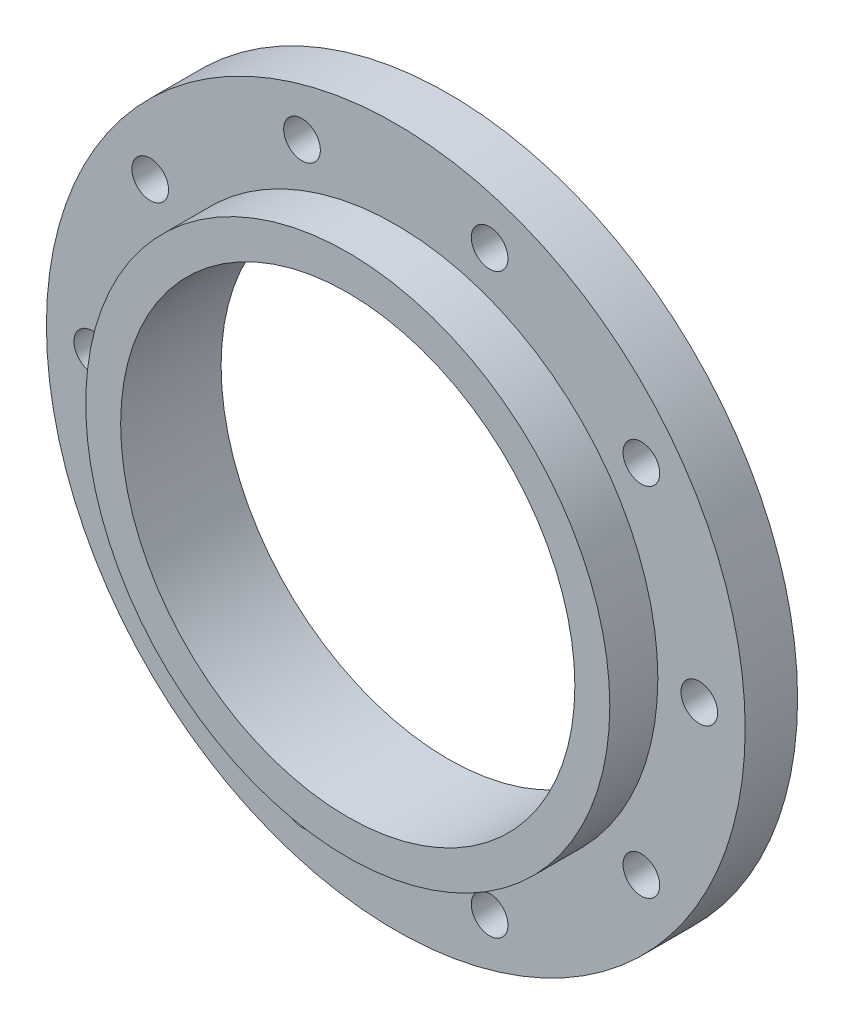
ISO-10303-21;
HEADER;
FILE_DESCRIPTION(('STEP AP214'),'2;1');
FILE_NAME('part.step','',(''),(''),'','','');
FILE_SCHEMA(('AUTOMOTIVE_DESIGN { 1 0 10303 214 1 1 1 1 }'));
ENDSEC;
DATA;
#1=APPLICATION_CONTEXT('core data for automotive mechanical design processes');
#2=APPLICATION_PROTOCOL_DEFINITION('international standard','automotive_design',2000,#1);
#3=PRODUCT_CONTEXT('',#1,'mechanical');
#4=PRODUCT('Part','Part','',(#3));
#5=PRODUCT_RELATED_PRODUCT_CATEGORY('part','',(#4));
#6=PRODUCT_DEFINITION_FORMATION('','',#4);
#7=PRODUCT_DEFINITION_CONTEXT('part definition',#1,'design');
#8=PRODUCT_DEFINITION('design','',#6,#7);
#9=PRODUCT_DEFINITION_SHAPE('','',#8);
#10=(LENGTH_UNIT() NAMED_UNIT(*) SI_UNIT(.MILLI.,.METRE.));
#11=(NAMED_UNIT(*) PLANE_ANGLE_UNIT() SI_UNIT($,.RADIAN.));
#12=(NAMED_UNIT(*) SI_UNIT($,.STERADIAN.) SOLID_ANGLE_UNIT());
#13=UNCERTAINTY_MEASURE_WITH_UNIT(LENGTH_MEASURE(1.E-05),#10,'distance_accuracy_value','');
#14=(GEOMETRIC_REPRESENTATION_CONTEXT(3) GLOBAL_UNCERTAINTY_ASSIGNED_CONTEXT((#13)) GLOBAL_UNIT_ASSIGNED_CONTEXT((#10,
#11,#12)) REPRESENTATION_CONTEXT('',''));
#15=CARTESIAN_POINT('',(0.,0.,0.));
#16=DIRECTION('',(0.,0.,1.));
#17=DIRECTION('',(1.,0.,0.));
#18=AXIS2_PLACEMENT_3D('',#15,#16,#17);
#19=CARTESIAN_POINT('',(0.,0.,0.));
#20=DIRECTION('',(0.,0.,-1.));
#21=DIRECTION('',(-1.,0.,0.));
#22=AXIS2_PLACEMENT_3D('',#19,#20,#21);
#23=CYLINDRICAL_SURFACE('',#22,80.);
#24=CARTESIAN_POINT('',(0.,0.,0.));
#25=DIRECTION('',(0.,0.,-1.));
#26=DIRECTION('',(-1.,0.,0.));
#27=AXIS2_PLACEMENT_3D('',#24,#25,#26);
#28=CIRCLE('',#27,80.);
#29=CARTESIAN_POINT('',(-80.,0.,0.));
#30=VERTEX_POINT('',#29);
#31=EDGE_CURVE('E48',#30,#30,#28,.T.);
#32=ORIENTED_EDGE('',*,*,#31,.T.);
#33=EDGE_LOOP('',(#32));
#34=FACE_BOUND('',#33,.T.);
#35=CARTESIAN_POINT('',(0.,0.,-12.));
#36=DIRECTION('',(0.,0.,-1.));
#37=DIRECTION('',(-1.,0.,0.));
#38=AXIS2_PLACEMENT_3D('',#35,#36,#37);
#39=CIRCLE('',#38,80.);
#40=CARTESIAN_POINT('',(-80.,0.,-12.));
#41=VERTEX_POINT('',#40);
#42=EDGE_CURVE('E53',#41,#41,#39,.T.);
#43=ORIENTED_EDGE('',*,*,#42,.F.);
#44=EDGE_LOOP('',(#43));
#45=FACE_BOUND('',#44,.T.);
#46=ADVANCED_FACE('F41',(#34,#45),#23,.T.);
#47=CARTESIAN_POINT('',(80.,0.,0.));
#48=DIRECTION('',(0.,0.,1.));
#49=DIRECTION('',(1.,0.,0.));
#50=AXIS2_PLACEMENT_3D('',#47,#48,#49);
#51=PLANE('',#50);
#52=CARTESIAN_POINT('',(-21.4766811090589,66.0984278825132,0.));
#53=DIRECTION('',(0.,0.,1.));
#54=DIRECTION('',(1.,0.,0.));
#55=AXIS2_PLACEMENT_3D('',#52,#53,#54);
#56=CIRCLE('',#55,4.19999999999999);
#57=CARTESIAN_POINT('',(-17.2766811090589,66.0984278825132,0.));
#58=VERTEX_POINT('',#57);
#59=EDGE_CURVE('E117',#58,#58,#56,.T.);
#60=ORIENTED_EDGE('',*,*,#59,.F.);
#61=EDGE_LOOP('',(#60));
#62=FACE_BOUND('',#61,.T.);
#63=CARTESIAN_POINT('',(-56.2266811090589,40.8510750343268,0.));
#64=DIRECTION('',(0.,0.,1.));
#65=DIRECTION('',(1.,0.,0.));
#66=AXIS2_PLACEMENT_3D('',#63,#64,#65);
#67=CIRCLE('',#66,4.19999999999999);
#68=CARTESIAN_POINT('',(-52.0266811090589,40.8510750343268,0.));
#69=VERTEX_POINT('',#68);
#70=EDGE_CURVE('E111',#69,#69,#67,.T.);
#71=ORIENTED_EDGE('',*,*,#70,.F.);
#72=EDGE_LOOP('',(#71));
#73=FACE_BOUND('',#72,.T.);
#74=CARTESIAN_POINT('',(-69.5,0.,0.));
#75=DIRECTION('',(0.,0.,1.));
#76=DIRECTION('',(1.,0.,0.));
#77=AXIS2_PLACEMENT_3D('',#74,#75,#76);
#78=CIRCLE('',#77,4.19999999999998);
#79=CARTESIAN_POINT('',(-65.3,0.,0.));
#80=VERTEX_POINT('',#79);
#81=EDGE_CURVE('E105',#80,#80,#78,.T.);
#82=ORIENTED_EDGE('',*,*,#81,.F.);
#83=EDGE_LOOP('',(#82));
#84=FACE_BOUND('',#83,.T.);
#85=CARTESIAN_POINT('',(-56.2266811090588,-40.851075034327,0.));
#86=DIRECTION('',(0.,0.,1.));
#87=DIRECTION('',(1.,0.,0.));
#88=AXIS2_PLACEMENT_3D('',#85,#86,#87);
#89=CIRCLE('',#88,4.19999999999999);
#90=CARTESIAN_POINT('',(-52.0266811090588,-40.851075034327,0.));
#91=VERTEX_POINT('',#90);
#92=EDGE_CURVE('E99',#91,#91,#89,.T.);
#93=ORIENTED_EDGE('',*,*,#92,.F.);
#94=EDGE_LOOP('',(#93));
#95=FACE_BOUND('',#94,.T.);
#96=CARTESIAN_POINT('',(-21.4766811090588,-66.0984278825132,0.));
#97=DIRECTION('',(0.,0.,1.));
#98=DIRECTION('',(1.,0.,0.));
#99=AXIS2_PLACEMENT_3D('',#96,#97,#98);
#100=CIRCLE('',#99,4.19999999999999);
#101=CARTESIAN_POINT('',(-17.2766811090588,-66.0984278825132,0.));
#102=VERTEX_POINT('',#101);
#103=EDGE_CURVE('E93',#102,#102,#100,.T.);
#104=ORIENTED_EDGE('',*,*,#103,.F.);
#105=EDGE_LOOP('',(#104));
#106=FACE_BOUND('',#105,.T.);
#107=CARTESIAN_POINT('',(21.4766811090589,-66.0984278825132,0.));
#108=DIRECTION('',(0.,0.,1.));
#109=DIRECTION('',(1.,0.,0.));
#110=AXIS2_PLACEMENT_3D('',#107,#108,#109);
#111=CIRCLE('',#110,4.19999999999999);
#112=CARTESIAN_POINT('',(25.6766811090589,-66.0984278825132,0.));
#113=VERTEX_POINT('',#112);
#114=EDGE_CURVE('E87',#113,#113,#111,.T.);
#115=ORIENTED_EDGE('',*,*,#114,.F.);
#116=EDGE_LOOP('',(#115));
#117=FACE_BOUND('',#116,.T.);
#118=CARTESIAN_POINT('',(56.2266811090589,-40.8510750343268,0.));
#119=DIRECTION('',(0.,0.,1.));
#120=DIRECTION('',(1.,0.,0.));
#121=AXIS2_PLACEMENT_3D('',#118,#119,#120);
#122=CIRCLE('',#121,4.19999999999999);
#123=CARTESIAN_POINT('',(60.4266811090589,-40.8510750343268,0.));
#124=VERTEX_POINT('',#123);
#125=EDGE_CURVE('E44',#124,#124,#122,.T.);
#126=ORIENTED_EDGE('',*,*,#125,.F.);
#127=EDGE_LOOP('',(#126));
#128=FACE_BOUND('',#127,.T.);
#129=CARTESIAN_POINT('',(69.5,0.,0.));
#130=DIRECTION('',(0.,0.,1.));
#131=DIRECTION('',(1.,0.,0.));
#132=AXIS2_PLACEMENT_3D('',#129,#130,#131);
#133=CIRCLE('',#132,4.19999999999998);
#134=CARTESIAN_POINT('',(73.7,0.,0.));
#135=VERTEX_POINT('',#134);
#136=EDGE_CURVE('E78',#135,#135,#133,.T.);
#137=ORIENTED_EDGE('',*,*,#136,.F.);
#138=EDGE_LOOP('',(#137));
#139=FACE_BOUND('',#138,.T.);
#140=CARTESIAN_POINT('',(56.2266811090588,40.8510750343269,0.));
#141=DIRECTION('',(0.,0.,1.));
#142=DIRECTION('',(1.,0.,0.));
#143=AXIS2_PLACEMENT_3D('',#140,#141,#142);
#144=CIRCLE('',#143,4.19999999999999);
#145=CARTESIAN_POINT('',(60.4266811090588,40.8510750343269,0.));
#146=VERTEX_POINT('',#145);
#147=EDGE_CURVE('E70',#146,#146,#144,.T.);
#148=ORIENTED_EDGE('',*,*,#147,.F.);
#149=EDGE_LOOP('',(#148));
#150=FACE_BOUND('',#149,.T.);
#151=CARTESIAN_POINT('',(21.4766811090588,66.0984278825132,0.));
#152=DIRECTION('',(0.,0.,1.));
#153=DIRECTION('',(1.,0.,0.));
#154=AXIS2_PLACEMENT_3D('',#151,#152,#153);
#155=CIRCLE('',#154,4.19999999999999);
#156=CARTESIAN_POINT('',(25.6766811090588,66.0984278825132,0.));
#157=VERTEX_POINT('',#156);
#158=EDGE_CURVE('E62',#157,#157,#155,.T.);
#159=ORIENTED_EDGE('',*,*,#158,.F.);
#160=EDGE_LOOP('',(#159));
#161=FACE_BOUND('',#160,.T.);
#162=CARTESIAN_POINT('',(0.,0.,0.));
#163=DIRECTION('',(0.,0.,1.));
#164=DIRECTION('',(1.,0.,0.));
#165=AXIS2_PLACEMENT_3D('',#162,#163,#164);
#166=CIRCLE('',#165,60.);
#167=CARTESIAN_POINT('',(60.,0.,0.));
#168=VERTEX_POINT('',#167);
#169=EDGE_CURVE('E10',#168,#168,#166,.T.);
#170=ORIENTED_EDGE('',*,*,#169,.F.);
#171=EDGE_LOOP('',(#170));
#172=FACE_BOUND('',#171,.T.);
#173=ORIENTED_EDGE('',*,*,#31,.F.);
#174=EDGE_LOOP('',(#173));
#175=FACE_BOUND('',#174,.T.);
#176=ADVANCED_FACE('F136',(#62,#73,#84,#95,#106,#117,#128,#139,#150,#161,#172,#175),#51,.T.);
#177=CARTESIAN_POINT('',(0.,0.,-12.));
#178=DIRECTION('',(0.,0.,-1.));
#179=DIRECTION('',(-1.,0.,0.));
#180=AXIS2_PLACEMENT_3D('',#177,#178,#179);
#181=PLANE('',#180);
#182=CARTESIAN_POINT('',(0.,0.,-12.));
#183=DIRECTION('',(0.,0.,-1.));
#184=DIRECTION('',(-1.,0.,0.));
#185=AXIS2_PLACEMENT_3D('',#182,#183,#184);
#186=CIRCLE('',#185,52.);
#187=CARTESIAN_POINT('',(-52.,0.,-12.));
#188=VERTEX_POINT('',#187);
#189=EDGE_CURVE('E126',#188,#188,#186,.T.);
#190=ORIENTED_EDGE('',*,*,#189,.F.);
#191=EDGE_LOOP('',(#190));
#192=FACE_BOUND('',#191,.T.);
#193=CARTESIAN_POINT('',(-21.4766811090589,66.0984278825132,-12.));
#194=DIRECTION('',(0.,0.,-1.));
#195=DIRECTION('',(-1.,0.,0.));
#196=AXIS2_PLACEMENT_3D('',#193,#194,#195);
#197=CIRCLE('',#196,4.19999999999999);
#198=CARTESIAN_POINT('',(-25.6766811090589,66.0984278825132,-12.));
#199=VERTEX_POINT('',#198);
#200=EDGE_CURVE('E120',#199,#199,#197,.T.);
#201=ORIENTED_EDGE('',*,*,#200,.F.);
#202=EDGE_LOOP('',(#201));
#203=FACE_BOUND('',#202,.T.);
#204=CARTESIAN_POINT('',(-56.2266811090589,40.8510750343268,-12.));
#205=DIRECTION('',(0.,0.,-1.));
#206=DIRECTION('',(-1.,0.,0.));
#207=AXIS2_PLACEMENT_3D('',#204,#205,#206);
#208=CIRCLE('',#207,4.19999999999999);
#209=CARTESIAN_POINT('',(-60.4266811090589,40.8510750343268,-12.));
#210=VERTEX_POINT('',#209);
#211=EDGE_CURVE('E114',#210,#210,#208,.T.);
#212=ORIENTED_EDGE('',*,*,#211,.F.);
#213=EDGE_LOOP('',(#212));
#214=FACE_BOUND('',#213,.T.);
#215=CARTESIAN_POINT('',(-69.5,0.,-12.));
#216=DIRECTION('',(0.,0.,-1.));
#217=DIRECTION('',(-1.,0.,0.));
#218=AXIS2_PLACEMENT_3D('',#215,#216,#217);
#219=CIRCLE('',#218,4.19999999999998);
#220=CARTESIAN_POINT('',(-73.7,0.,-12.));
#221=VERTEX_POINT('',#220);
#222=EDGE_CURVE('E108',#221,#221,#219,.T.);
#223=ORIENTED_EDGE('',*,*,#222,.F.);
#224=EDGE_LOOP('',(#223));
#225=FACE_BOUND('',#224,.T.);
#226=CARTESIAN_POINT('',(-56.2266811090588,-40.851075034327,-12.));
#227=DIRECTION('',(0.,0.,-1.));
#228=DIRECTION('',(-1.,0.,0.));
#229=AXIS2_PLACEMENT_3D('',#226,#227,#228);
#230=CIRCLE('',#229,4.19999999999999);
#231=CARTESIAN_POINT('',(-60.4266811090588,-40.851075034327,-12.));
#232=VERTEX_POINT('',#231);
#233=EDGE_CURVE('E102',#232,#232,#230,.T.);
#234=ORIENTED_EDGE('',*,*,#233,.F.);
#235=EDGE_LOOP('',(#234));
#236=FACE_BOUND('',#235,.T.);
#237=CARTESIAN_POINT('',(-21.4766811090588,-66.0984278825132,-12.));
#238=DIRECTION('',(0.,0.,-1.));
#239=DIRECTION('',(-1.,0.,0.));
#240=AXIS2_PLACEMENT_3D('',#237,#238,#239);
#241=CIRCLE('',#240,4.19999999999999);
#242=CARTESIAN_POINT('',(-25.6766811090588,-66.0984278825132,-12.));
#243=VERTEX_POINT('',#242);
#244=EDGE_CURVE('E96',#243,#243,#241,.T.);
#245=ORIENTED_EDGE('',*,*,#244,.F.);
#246=EDGE_LOOP('',(#245));
#247=FACE_BOUND('',#246,.T.);
#248=CARTESIAN_POINT('',(21.4766811090589,-66.0984278825132,-12.));
#249=DIRECTION('',(0.,0.,-1.));
#250=DIRECTION('',(-1.,0.,0.));
#251=AXIS2_PLACEMENT_3D('',#248,#249,#250);
#252=CIRCLE('',#251,4.19999999999999);
#253=CARTESIAN_POINT('',(17.2766811090589,-66.0984278825132,-12.));
#254=VERTEX_POINT('',#253);
#255=EDGE_CURVE('E90',#254,#254,#252,.T.);
#256=ORIENTED_EDGE('',*,*,#255,.F.);
#257=EDGE_LOOP('',(#256));
#258=FACE_BOUND('',#257,.T.);
#259=CARTESIAN_POINT('',(56.2266811090589,-40.8510750343268,-12.));
#260=DIRECTION('',(0.,0.,-1.));
#261=DIRECTION('',(-1.,0.,0.));
#262=AXIS2_PLACEMENT_3D('',#259,#260,#261);
#263=CIRCLE('',#262,4.19999999999999);
#264=CARTESIAN_POINT('',(52.0266811090589,-40.8510750343268,-12.));
#265=VERTEX_POINT('',#264);
#266=EDGE_CURVE('E84',#265,#265,#263,.T.);
#267=ORIENTED_EDGE('',*,*,#266,.F.);
#268=EDGE_LOOP('',(#267));
#269=FACE_BOUND('',#268,.T.);
#270=CARTESIAN_POINT('',(69.5,0.,-12.));
#271=DIRECTION('',(0.,0.,-1.));
#272=DIRECTION('',(-1.,0.,0.));
#273=AXIS2_PLACEMENT_3D('',#270,#271,#272);
#274=CIRCLE('',#273,4.19999999999998);
#275=CARTESIAN_POINT('',(65.3,0.,-12.));
#276=VERTEX_POINT('',#275);
#277=EDGE_CURVE('E81',#276,#276,#274,.T.);
#278=ORIENTED_EDGE('',*,*,#277,.F.);
#279=EDGE_LOOP('',(#278));
#280=FACE_BOUND('',#279,.T.);
#281=CARTESIAN_POINT('',(56.2266811090588,40.8510750343269,-12.));
#282=DIRECTION('',(0.,0.,-1.));
#283=DIRECTION('',(-1.,0.,0.));
#284=AXIS2_PLACEMENT_3D('',#281,#282,#283);
#285=CIRCLE('',#284,4.19999999999999);
#286=CARTESIAN_POINT('',(52.0266811090588,40.8510750343269,-12.));
#287=VERTEX_POINT('',#286);
#288=EDGE_CURVE('E75',#287,#287,#285,.T.);
#289=ORIENTED_EDGE('',*,*,#288,.F.);
#290=EDGE_LOOP('',(#289));
#291=FACE_BOUND('',#290,.T.);
#292=CARTESIAN_POINT('',(21.4766811090588,66.0984278825132,-12.));
#293=DIRECTION('',(0.,0.,-1.));
#294=DIRECTION('',(-1.,0.,0.));
#295=AXIS2_PLACEMENT_3D('',#292,#293,#294);
#296=CIRCLE('',#295,4.19999999999999);
#297=CARTESIAN_POINT('',(17.2766811090589,66.0984278825132,-12.));
#298=VERTEX_POINT('',#297);
#299=EDGE_CURVE('E66',#298,#298,#296,.T.);
#300=ORIENTED_EDGE('',*,*,#299,.F.);
#301=EDGE_LOOP('',(#300));
#302=FACE_BOUND('',#301,.T.);
#303=ORIENTED_EDGE('',*,*,#42,.T.);
#304=EDGE_LOOP('',(#303));
#305=FACE_BOUND('',#304,.T.);
#306=ADVANCED_FACE('F132',(#192,#203,#214,#225,#236,#247,#258,#269,#280,#291,#302,#305),#181,.T.);
#307=CARTESIAN_POINT('',(0.,0.,11.));
#308=DIRECTION('',(0.,0.,-1.));
#309=DIRECTION('',(-1.,0.,0.));
#310=AXIS2_PLACEMENT_3D('',#307,#308,#309);
#311=CYLINDRICAL_SURFACE('',#310,60.);
#312=CARTESIAN_POINT('',(0.,0.,11.));
#313=DIRECTION('',(0.,0.,1.));
#314=DIRECTION('',(1.,0.,0.));
#315=AXIS2_PLACEMENT_3D('',#312,#313,#314);
#316=CIRCLE('',#315,60.);
#317=CARTESIAN_POINT('',(60.,0.,11.));
#318=VERTEX_POINT('',#317);
#319=EDGE_CURVE('E56',#318,#318,#316,.T.);
#320=ORIENTED_EDGE('',*,*,#319,.F.);
#321=EDGE_LOOP('',(#320));
#322=FACE_BOUND('',#321,.T.);
#323=ORIENTED_EDGE('',*,*,#169,.T.);
#324=EDGE_LOOP('',(#323));
#325=FACE_BOUND('',#324,.T.);
#326=ADVANCED_FACE('F135',(#322,#325),#311,.T.);
#327=CARTESIAN_POINT('',(0.,0.,11.));
#328=DIRECTION('',(0.,0.,1.));
#329=DIRECTION('',(1.,0.,0.));
#330=AXIS2_PLACEMENT_3D('',#327,#328,#329);
#331=PLANE('',#330);
#332=CARTESIAN_POINT('',(0.,0.,11.));
#333=DIRECTION('',(0.,0.,-1.));
#334=DIRECTION('',(-1.,0.,0.));
#335=AXIS2_PLACEMENT_3D('',#332,#333,#334);
#336=CIRCLE('',#335,52.);
#337=CARTESIAN_POINT('',(-52.,0.,11.));
#338=VERTEX_POINT('',#337);
#339=EDGE_CURVE('E123',#338,#338,#336,.T.);
#340=ORIENTED_EDGE('',*,*,#339,.T.);
#341=EDGE_LOOP('',(#340));
#342=FACE_BOUND('',#341,.T.);
#343=ORIENTED_EDGE('',*,*,#319,.T.);
#344=EDGE_LOOP('',(#343));
#345=FACE_BOUND('',#344,.T.);
#346=ADVANCED_FACE('F161',(#342,#345),#331,.T.);
#347=CARTESIAN_POINT('',(21.4766811090588,66.0984278825132,-12.));
#348=DIRECTION('',(0.,0.,-1.));
#349=DIRECTION('',(-1.,0.,0.));
#350=AXIS2_PLACEMENT_3D('',#347,#348,#349);
#351=CYLINDRICAL_SURFACE('',#350,4.19999999999999);
#352=ORIENTED_EDGE('',*,*,#158,.T.);
#353=EDGE_LOOP('',(#352));
#354=FACE_BOUND('',#353,.T.);
#355=ORIENTED_EDGE('',*,*,#299,.T.);
#356=EDGE_LOOP('',(#355));
#357=FACE_BOUND('',#356,.T.);
#358=ADVANCED_FACE('F158',(#354,#357),#351,.F.);
#359=CARTESIAN_POINT('',(56.2266811090588,40.8510750343269,-12.));
#360=DIRECTION('',(0.,0.,-1.));
#361=DIRECTION('',(-1.,0.,0.));
#362=AXIS2_PLACEMENT_3D('',#359,#360,#361);
#363=CYLINDRICAL_SURFACE('',#362,4.19999999999999);
#364=ORIENTED_EDGE('',*,*,#147,.T.);
#365=EDGE_LOOP('',(#364));
#366=FACE_BOUND('',#365,.T.);
#367=ORIENTED_EDGE('',*,*,#288,.T.);
#368=EDGE_LOOP('',(#367));
#369=FACE_BOUND('',#368,.T.);
#370=ADVANCED_FACE('F160',(#366,#369),#363,.F.);
#371=CARTESIAN_POINT('',(69.5,0.,-12.));
#372=DIRECTION('',(0.,0.,-1.));
#373=DIRECTION('',(-1.,0.,0.));
#374=AXIS2_PLACEMENT_3D('',#371,#372,#373);
#375=CYLINDRICAL_SURFACE('',#374,4.19999999999998);
#376=ORIENTED_EDGE('',*,*,#136,.T.);
#377=EDGE_LOOP('',(#376));
#378=FACE_BOUND('',#377,.T.);
#379=ORIENTED_EDGE('',*,*,#277,.T.);
#380=EDGE_LOOP('',(#379));
#381=FACE_BOUND('',#380,.T.);
#382=ADVANCED_FACE('F167',(#378,#381),#375,.F.);
#383=CARTESIAN_POINT('',(56.2266811090589,-40.8510750343268,-12.));
#384=DIRECTION('',(0.,0.,-1.));
#385=DIRECTION('',(-1.,0.,0.));
#386=AXIS2_PLACEMENT_3D('',#383,#384,#385);
#387=CYLINDRICAL_SURFACE('',#386,4.19999999999999);
#388=ORIENTED_EDGE('',*,*,#125,.T.);
#389=EDGE_LOOP('',(#388));
#390=FACE_BOUND('',#389,.T.);
#391=ORIENTED_EDGE('',*,*,#266,.T.);
#392=EDGE_LOOP('',(#391));
#393=FACE_BOUND('',#392,.T.);
#394=ADVANCED_FACE('F221',(#390,#393),#387,.F.);
#395=CARTESIAN_POINT('',(21.4766811090589,-66.0984278825132,-12.));
#396=DIRECTION('',(0.,0.,-1.));
#397=DIRECTION('',(-1.,0.,0.));
#398=AXIS2_PLACEMENT_3D('',#395,#396,#397);
#399=CYLINDRICAL_SURFACE('',#398,4.19999999999999);
#400=ORIENTED_EDGE('',*,*,#114,.T.);
#401=EDGE_LOOP('',(#400));
#402=FACE_BOUND('',#401,.T.);
#403=ORIENTED_EDGE('',*,*,#255,.T.);
#404=EDGE_LOOP('',(#403));
#405=FACE_BOUND('',#404,.T.);
#406=ADVANCED_FACE('F231',(#402,#405),#399,.F.);
#407=CARTESIAN_POINT('',(-21.4766811090588,-66.0984278825132,-12.));
#408=DIRECTION('',(0.,0.,-1.));
#409=DIRECTION('',(-1.,0.,0.));
#410=AXIS2_PLACEMENT_3D('',#407,#408,#409);
#411=CYLINDRICAL_SURFACE('',#410,4.19999999999999);
#412=ORIENTED_EDGE('',*,*,#103,.T.);
#413=EDGE_LOOP('',(#412));
#414=FACE_BOUND('',#413,.T.);
#415=ORIENTED_EDGE('',*,*,#244,.T.);
#416=EDGE_LOOP('',(#415));
#417=FACE_BOUND('',#416,.T.);
#418=ADVANCED_FACE('F241',(#414,#417),#411,.F.);
#419=CARTESIAN_POINT('',(-56.2266811090588,-40.851075034327,-12.));
#420=DIRECTION('',(0.,0.,-1.));
#421=DIRECTION('',(-1.,0.,0.));
#422=AXIS2_PLACEMENT_3D('',#419,#420,#421);
#423=CYLINDRICAL_SURFACE('',#422,4.19999999999999);
#424=ORIENTED_EDGE('',*,*,#92,.T.);
#425=EDGE_LOOP('',(#424));
#426=FACE_BOUND('',#425,.T.);
#427=ORIENTED_EDGE('',*,*,#233,.T.);
#428=EDGE_LOOP('',(#427));
#429=FACE_BOUND('',#428,.T.);
#430=ADVANCED_FACE('F251',(#426,#429),#423,.F.);
#431=CARTESIAN_POINT('',(-69.5,0.,-12.));
#432=DIRECTION('',(0.,0.,-1.));
#433=DIRECTION('',(-1.,0.,0.));
#434=AXIS2_PLACEMENT_3D('',#431,#432,#433);
#435=CYLINDRICAL_SURFACE('',#434,4.19999999999998);
#436=ORIENTED_EDGE('',*,*,#81,.T.);
#437=EDGE_LOOP('',(#436));
#438=FACE_BOUND('',#437,.T.);
#439=ORIENTED_EDGE('',*,*,#222,.T.);
#440=EDGE_LOOP('',(#439));
#441=FACE_BOUND('',#440,.T.);
#442=ADVANCED_FACE('F261',(#438,#441),#435,.F.);
#443=CARTESIAN_POINT('',(-56.2266811090589,40.8510750343268,-12.));
#444=DIRECTION('',(0.,0.,-1.));
#445=DIRECTION('',(-1.,0.,0.));
#446=AXIS2_PLACEMENT_3D('',#443,#444,#445);
#447=CYLINDRICAL_SURFACE('',#446,4.19999999999999);
#448=ORIENTED_EDGE('',*,*,#70,.T.);
#449=EDGE_LOOP('',(#448));
#450=FACE_BOUND('',#449,.T.);
#451=ORIENTED_EDGE('',*,*,#211,.T.);
#452=EDGE_LOOP('',(#451));
#453=FACE_BOUND('',#452,.T.);
#454=ADVANCED_FACE('F271',(#450,#453),#447,.F.);
#455=CARTESIAN_POINT('',(-21.4766811090589,66.0984278825132,-12.));
#456=DIRECTION('',(0.,0.,-1.));
#457=DIRECTION('',(-1.,0.,0.));
#458=AXIS2_PLACEMENT_3D('',#455,#456,#457);
#459=CYLINDRICAL_SURFACE('',#458,4.19999999999999);
#460=ORIENTED_EDGE('',*,*,#59,.T.);
#461=EDGE_LOOP('',(#460));
#462=FACE_BOUND('',#461,.T.);
#463=ORIENTED_EDGE('',*,*,#200,.T.);
#464=EDGE_LOOP('',(#463));
#465=FACE_BOUND('',#464,.T.);
#466=ADVANCED_FACE('F281',(#462,#465),#459,.F.);
#467=CARTESIAN_POINT('',(0.,0.,-12.));
#468=DIRECTION('',(0.,0.,-1.));
#469=DIRECTION('',(-1.,0.,0.));
#470=AXIS2_PLACEMENT_3D('',#467,#468,#469);
#471=CYLINDRICAL_SURFACE('',#470,52.);
#472=ORIENTED_EDGE('',*,*,#339,.F.);
#473=EDGE_LOOP('',(#472));
#474=FACE_BOUND('',#473,.T.);
#475=ORIENTED_EDGE('',*,*,#189,.T.);
#476=EDGE_LOOP('',(#475));
#477=FACE_BOUND('',#476,.T.);
#478=ADVANCED_FACE('F130',(#474,#477),#471,.F.);
#479=CLOSED_SHELL('',(#46,#176,#306,#326,#346,#358,#370,#382,#394,#406,#418,#430,#442,#454,#466,#478));
#480=MANIFOLD_SOLID_BREP('B2',#479);
#481=ADVANCED_BREP_SHAPE_REPRESENTATION('',(#18,#480),#14);
#482=SHAPE_DEFINITION_REPRESENTATION(#9,#481);
ENDSEC;
END-ISO-10303-21;
